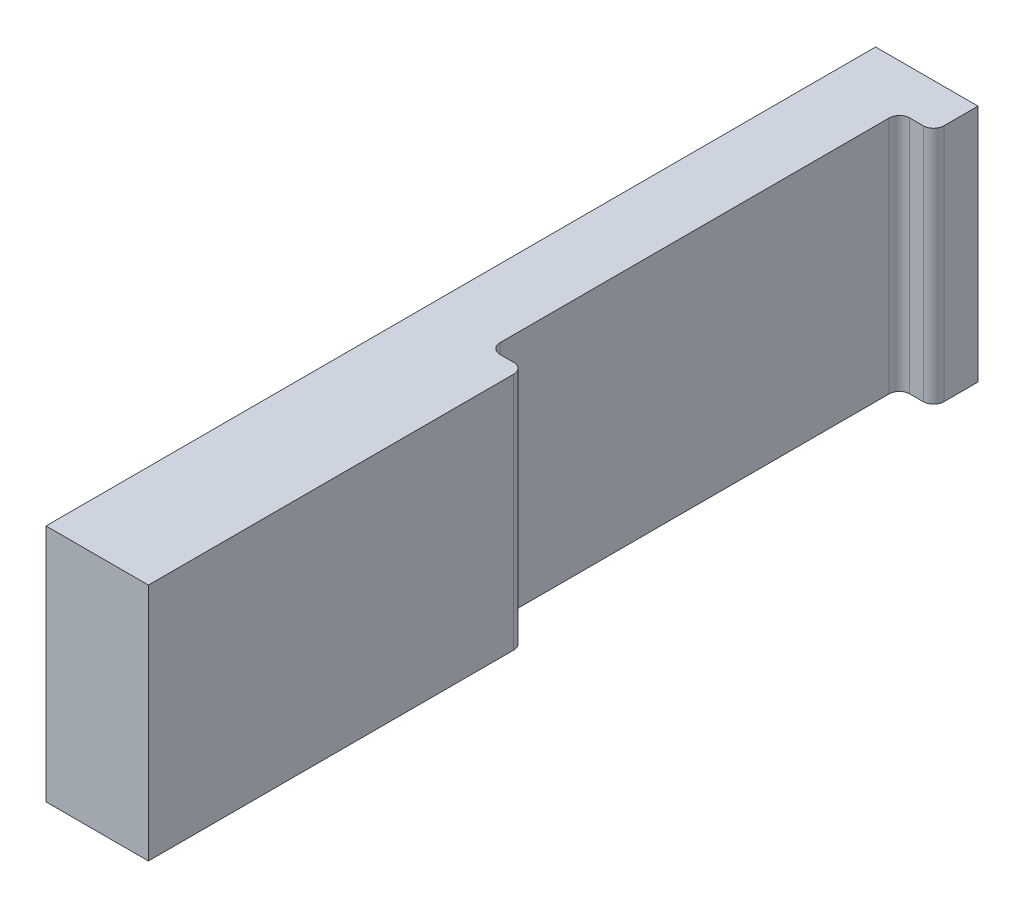
ISO-10303-21;
HEADER;
FILE_DESCRIPTION(('STEP AP214'),'2;1');
FILE_NAME('part.step','',(''),(''),'','','');
FILE_SCHEMA(('AUTOMOTIVE_DESIGN { 1 0 10303 214 1 1 1 1 }'));
ENDSEC;
DATA;
#1=APPLICATION_CONTEXT('core data for automotive mechanical design processes');
#2=APPLICATION_PROTOCOL_DEFINITION('international standard','automotive_design',2000,#1);
#3=PRODUCT_CONTEXT('',#1,'mechanical');
#4=PRODUCT('Part','Part','',(#3));
#5=PRODUCT_RELATED_PRODUCT_CATEGORY('part','',(#4));
#6=PRODUCT_DEFINITION_FORMATION('','',#4);
#7=PRODUCT_DEFINITION_CONTEXT('part definition',#1,'design');
#8=PRODUCT_DEFINITION('design','',#6,#7);
#9=PRODUCT_DEFINITION_SHAPE('','',#8);
#10=(LENGTH_UNIT() NAMED_UNIT(*) SI_UNIT(.MILLI.,.METRE.));
#11=(NAMED_UNIT(*) PLANE_ANGLE_UNIT() SI_UNIT($,.RADIAN.));
#12=(NAMED_UNIT(*) SI_UNIT($,.STERADIAN.) SOLID_ANGLE_UNIT());
#13=UNCERTAINTY_MEASURE_WITH_UNIT(LENGTH_MEASURE(1.E-05),#10,'distance_accuracy_value','');
#14=(GEOMETRIC_REPRESENTATION_CONTEXT(3) GLOBAL_UNCERTAINTY_ASSIGNED_CONTEXT((#13)) GLOBAL_UNIT_ASSIGNED_CONTEXT((#10,
#11,#12)) REPRESENTATION_CONTEXT('',''));
#15=CARTESIAN_POINT('',(0.,0.,0.));
#16=DIRECTION('',(0.,0.,1.));
#17=DIRECTION('',(1.,0.,0.));
#18=AXIS2_PLACEMENT_3D('',#15,#16,#17);
#19=CARTESIAN_POINT('',(39.76358420169,70.,-88.5010150339644));
#20=DIRECTION('',(-1.,0.,0.));
#21=DIRECTION('',(0.,0.,1.));
#22=AXIS2_PLACEMENT_3D('',#19,#20,#21);
#23=PLANE('',#22);
#24=DIRECTION('',(0.,0.,-1.));
#25=VECTOR('',#24,1.);
#26=CARTESIAN_POINT('',(39.76358420169,0.,-88.5010150339644));
#27=LINE('',#26,#25);
#28=CARTESIAN_POINT('',(39.76358420169,0.,154.498984966036));
#29=VERTEX_POINT('',#28);
#30=CARTESIAN_POINT('',(39.76358420169,0.,47.4989849660356));
#31=VERTEX_POINT('',#30);
#32=EDGE_CURVE('E223',#29,#31,#27,.T.);
#33=ORIENTED_EDGE('',*,*,#32,.T.);
#34=DIRECTION('',(0.,1.,0.));
#35=VECTOR('',#34,1.);
#36=CARTESIAN_POINT('',(39.76358420169,70.,47.4989849660356));
#37=LINE('',#36,#35);
#38=CARTESIAN_POINT('',(39.76358420169,70.,47.4989849660356));
#39=VERTEX_POINT('',#38);
#40=EDGE_CURVE('E175',#31,#39,#37,.T.);
#41=ORIENTED_EDGE('',*,*,#40,.T.);
#42=DIRECTION('',(0.,0.,-1.));
#43=VECTOR('',#42,1.);
#44=CARTESIAN_POINT('',(39.76358420169,70.,-88.5010150339644));
#45=LINE('',#44,#43);
#46=CARTESIAN_POINT('',(39.76358420169,70.,154.498984966036));
#47=VERTEX_POINT('',#46);
#48=EDGE_CURVE('E217',#47,#39,#45,.T.);
#49=ORIENTED_EDGE('',*,*,#48,.F.);
#50=DIRECTION('',(0.,-1.,0.));
#51=VECTOR('',#50,1.);
#52=CARTESIAN_POINT('',(39.76358420169,70.,154.498984966036));
#53=LINE('',#52,#51);
#54=EDGE_CURVE('E131',#47,#29,#53,.T.);
#55=ORIENTED_EDGE('',*,*,#54,.T.);
#56=EDGE_LOOP('',(#33,#41,#49,#55));
#57=FACE_BOUND('',#56,.T.);
#58=ADVANCED_FACE('F33',(#57),#23,.F.);
#59=CARTESIAN_POINT('',(9.76358420168996,70.,-88.5010150339644));
#60=DIRECTION('',(1.,0.,0.));
#61=DIRECTION('',(0.,0.,-1.));
#62=AXIS2_PLACEMENT_3D('',#59,#60,#61);
#63=PLANE('',#62);
#64=DIRECTION('',(0.,0.,1.));
#65=VECTOR('',#64,1.);
#66=CARTESIAN_POINT('',(9.76358420168996,0.,-88.5010150339644));
#67=LINE('',#66,#65);
#68=CARTESIAN_POINT('',(9.76358420168996,0.,-88.5010150339644));
#69=VERTEX_POINT('',#68);
#70=CARTESIAN_POINT('',(9.76358420168999,0.,154.498984966036));
#71=VERTEX_POINT('',#70);
#72=EDGE_CURVE('E150',#69,#71,#67,.T.);
#73=ORIENTED_EDGE('',*,*,#72,.T.);
#74=DIRECTION('',(0.,-1.,0.));
#75=VECTOR('',#74,1.);
#76=CARTESIAN_POINT('',(9.76358420168999,70.,154.498984966036));
#77=LINE('',#76,#75);
#78=CARTESIAN_POINT('',(9.76358420168999,70.,154.498984966036));
#79=VERTEX_POINT('',#78);
#80=EDGE_CURVE('E128',#79,#71,#77,.T.);
#81=ORIENTED_EDGE('',*,*,#80,.F.);
#82=DIRECTION('',(0.,0.,1.));
#83=VECTOR('',#82,1.);
#84=CARTESIAN_POINT('',(9.76358420168996,70.,-88.5010150339644));
#85=LINE('',#84,#83);
#86=CARTESIAN_POINT('',(9.76358420168996,70.,-88.5010150339644));
#87=VERTEX_POINT('',#86);
#88=EDGE_CURVE('E136',#87,#79,#85,.T.);
#89=ORIENTED_EDGE('',*,*,#88,.F.);
#90=DIRECTION('',(0.,-1.,0.));
#91=VECTOR('',#90,1.);
#92=CARTESIAN_POINT('',(9.76358420168996,70.,-88.5010150339644));
#93=LINE('',#92,#91);
#94=EDGE_CURVE('E219',#87,#69,#93,.T.);
#95=ORIENTED_EDGE('',*,*,#94,.T.);
#96=EDGE_LOOP('',(#73,#81,#89,#95));
#97=FACE_BOUND('',#96,.T.);
#98=ADVANCED_FACE('F148',(#97),#63,.F.);
#99=CARTESIAN_POINT('',(9.76358420168999,70.,154.498984966036));
#100=DIRECTION('',(0.,0.,-1.));
#101=DIRECTION('',(-1.,0.,0.));
#102=AXIS2_PLACEMENT_3D('',#99,#100,#101);
#103=PLANE('',#102);
#104=DIRECTION('',(1.,0.,0.));
#105=VECTOR('',#104,1.);
#106=CARTESIAN_POINT('',(9.76358420168999,0.,154.498984966036));
#107=LINE('',#106,#105);
#108=EDGE_CURVE('E207',#71,#29,#107,.T.);
#109=ORIENTED_EDGE('',*,*,#108,.T.);
#110=ORIENTED_EDGE('',*,*,#54,.F.);
#111=DIRECTION('',(1.,0.,0.));
#112=VECTOR('',#111,1.);
#113=CARTESIAN_POINT('',(9.76358420168999,70.,154.498984966036));
#114=LINE('',#113,#112);
#115=EDGE_CURVE('E124',#79,#47,#114,.T.);
#116=ORIENTED_EDGE('',*,*,#115,.F.);
#117=ORIENTED_EDGE('',*,*,#80,.T.);
#118=EDGE_LOOP('',(#109,#110,#116,#117));
#119=FACE_BOUND('',#118,.T.);
#120=ADVANCED_FACE('F126',(#119),#103,.F.);
#121=CARTESIAN_POINT('',(39.76358420169,70.,-78.5010150339644));
#122=VERTEX_POINT('',#121);
#123=CARTESIAN_POINT('',(39.76358420169,70.,-88.5010150339644));
#124=VERTEX_POINT('',#123);
#125=EDGE_CURVE('E135',#122,#124,#45,.T.);
#126=ORIENTED_EDGE('',*,*,#125,.F.);
#127=DIRECTION('',(0.,1.,0.));
#128=VECTOR('',#127,1.);
#129=CARTESIAN_POINT('',(39.76358420169,70.,-78.5010150339644));
#130=LINE('',#129,#128);
#131=CARTESIAN_POINT('',(39.76358420169,0.,-78.5010150339644));
#132=VERTEX_POINT('',#131);
#133=EDGE_CURVE('E165',#122,#132,#130,.F.);
#134=ORIENTED_EDGE('',*,*,#133,.T.);
#135=CARTESIAN_POINT('',(39.76358420169,0.,-88.5010150339644));
#136=VERTEX_POINT('',#135);
#137=EDGE_CURVE('E222',#132,#136,#27,.T.);
#138=ORIENTED_EDGE('',*,*,#137,.T.);
#139=DIRECTION('',(0.,-1.,0.));
#140=VECTOR('',#139,1.);
#141=CARTESIAN_POINT('',(39.76358420169,70.,-88.5010150339644));
#142=LINE('',#141,#140);
#143=EDGE_CURVE('E155',#124,#136,#142,.T.);
#144=ORIENTED_EDGE('',*,*,#143,.F.);
#145=EDGE_LOOP('',(#126,#134,#138,#144));
#146=FACE_BOUND('',#145,.T.);
#147=ADVANCED_FACE('F250',(#146),#23,.F.);
#148=CARTESIAN_POINT('',(9.76358420168996,70.,-88.5010150339644));
#149=DIRECTION('',(0.,0.,1.));
#150=DIRECTION('',(1.,0.,0.));
#151=AXIS2_PLACEMENT_3D('',#148,#149,#150);
#152=PLANE('',#151);
#153=DIRECTION('',(-1.,0.,0.));
#154=VECTOR('',#153,1.);
#155=CARTESIAN_POINT('',(9.76358420168996,0.,-88.5010150339644));
#156=LINE('',#155,#154);
#157=EDGE_CURVE('E146',#136,#69,#156,.T.);
#158=ORIENTED_EDGE('',*,*,#157,.T.);
#159=ORIENTED_EDGE('',*,*,#94,.F.);
#160=DIRECTION('',(-1.,0.,0.));
#161=VECTOR('',#160,1.);
#162=CARTESIAN_POINT('',(9.76358420168996,70.,-88.5010150339644));
#163=LINE('',#162,#161);
#164=EDGE_CURVE('E142',#124,#87,#163,.T.);
#165=ORIENTED_EDGE('',*,*,#164,.F.);
#166=ORIENTED_EDGE('',*,*,#143,.T.);
#167=EDGE_LOOP('',(#158,#159,#165,#166));
#168=FACE_BOUND('',#167,.T.);
#169=ADVANCED_FACE('F230',(#168),#152,.F.);
#170=CARTESIAN_POINT('',(0.,70.,0.));
#171=DIRECTION('',(0.,1.,0.));
#172=DIRECTION('',(0.,0.,1.));
#173=AXIS2_PLACEMENT_3D('',#170,#171,#172);
#174=PLANE('',#173);
#175=DIRECTION('',(-1.,0.,0.));
#176=VECTOR('',#175,1.);
#177=CARTESIAN_POINT('',(39.76358420169,70.,-75.5010150339644));
#178=LINE('',#177,#176);
#179=CARTESIAN_POINT('',(36.76358420169,70.,-75.5010150339644));
#180=VERTEX_POINT('',#179);
#181=CARTESIAN_POINT('',(32.76358420169,70.,-75.5010150339644));
#182=VERTEX_POINT('',#181);
#183=EDGE_CURVE('E198',#180,#182,#178,.T.);
#184=ORIENTED_EDGE('',*,*,#183,.F.);
#185=CARTESIAN_POINT('',(36.76358420169,70.,-78.5010150339644));
#186=DIRECTION('',(0.,1.,0.));
#187=DIRECTION('',(0.,0.,1.));
#188=AXIS2_PLACEMENT_3D('',#185,#186,#187);
#189=CIRCLE('',#188,3.);
#190=EDGE_CURVE('E163',#180,#122,#189,.T.);
#191=ORIENTED_EDGE('',*,*,#190,.T.);
#192=ORIENTED_EDGE('',*,*,#125,.T.);
#193=ORIENTED_EDGE('',*,*,#164,.T.);
#194=ORIENTED_EDGE('',*,*,#88,.T.);
#195=ORIENTED_EDGE('',*,*,#115,.T.);
#196=ORIENTED_EDGE('',*,*,#48,.T.);
#197=CARTESIAN_POINT('',(36.76358420169,70.,47.4989849660356));
#198=DIRECTION('',(0.,1.,0.));
#199=DIRECTION('',(0.,0.,1.));
#200=AXIS2_PLACEMENT_3D('',#197,#198,#199);
#201=CIRCLE('',#200,3.);
#202=CARTESIAN_POINT('',(36.76358420169,70.,44.4989849660356));
#203=VERTEX_POINT('',#202);
#204=EDGE_CURVE('E161',#39,#203,#201,.T.);
#205=ORIENTED_EDGE('',*,*,#204,.T.);
#206=DIRECTION('',(1.,0.,0.));
#207=VECTOR('',#206,1.);
#208=CARTESIAN_POINT('',(39.76358420169,70.,44.4989849660356));
#209=LINE('',#208,#207);
#210=CARTESIAN_POINT('',(32.76358420169,70.,44.4989849660356));
#211=VERTEX_POINT('',#210);
#212=EDGE_CURVE('E189',#211,#203,#209,.T.);
#213=ORIENTED_EDGE('',*,*,#212,.F.);
#214=CARTESIAN_POINT('',(32.76358420169,70.,41.4989849660356));
#215=DIRECTION('',(0.,1.,0.));
#216=DIRECTION('',(0.,0.,1.));
#217=AXIS2_PLACEMENT_3D('',#214,#215,#216);
#218=CIRCLE('',#217,3.);
#219=CARTESIAN_POINT('',(29.76358420169,70.,41.4989849660356));
#220=VERTEX_POINT('',#219);
#221=EDGE_CURVE('E41',#211,#220,#218,.F.);
#222=ORIENTED_EDGE('',*,*,#221,.T.);
#223=DIRECTION('',(0.,0.,1.));
#224=VECTOR('',#223,1.);
#225=CARTESIAN_POINT('',(29.76358420169,70.,-75.5010150339644));
#226=LINE('',#225,#224);
#227=CARTESIAN_POINT('',(29.76358420169,70.,-72.5010150339644));
#228=VERTEX_POINT('',#227);
#229=EDGE_CURVE('E188',#228,#220,#226,.T.);
#230=ORIENTED_EDGE('',*,*,#229,.F.);
#231=CARTESIAN_POINT('',(32.76358420169,70.,-72.5010150339644));
#232=DIRECTION('',(0.,1.,0.));
#233=DIRECTION('',(0.,0.,1.));
#234=AXIS2_PLACEMENT_3D('',#231,#232,#233);
#235=CIRCLE('',#234,3.);
#236=EDGE_CURVE('E182',#228,#182,#235,.F.);
#237=ORIENTED_EDGE('',*,*,#236,.T.);
#238=EDGE_LOOP('',(#184,#191,#192,#193,#194,#195,#196,#205,#213,#222,#230,#237));
#239=FACE_BOUND('',#238,.T.);
#240=ADVANCED_FACE('F140',(#239),#174,.T.);
#241=CARTESIAN_POINT('',(0.,0.,0.));
#242=DIRECTION('',(0.,1.,0.));
#243=DIRECTION('',(0.,0.,1.));
#244=AXIS2_PLACEMENT_3D('',#241,#242,#243);
#245=PLANE('',#244);
#246=CARTESIAN_POINT('',(19.76358420169,0.,-10.1310150339644));
#247=DIRECTION('',(0.,-1.,0.));
#248=DIRECTION('',(0.,0.,-1.));
#249=AXIS2_PLACEMENT_3D('',#246,#247,#248);
#250=CIRCLE('',#249,1.5);
#251=CARTESIAN_POINT('',(19.76358420169,0.,-11.6310150339644));
#252=VERTEX_POINT('',#251);
#253=EDGE_CURVE('E278',#252,#252,#250,.T.);
#254=ORIENTED_EDGE('',*,*,#253,.F.);
#255=EDGE_LOOP('',(#254));
#256=FACE_BOUND('',#255,.T.);
#257=CARTESIAN_POINT('',(29.76358420169,0.,124.498984966036));
#258=DIRECTION('',(0.,-1.,0.));
#259=DIRECTION('',(0.,0.,-1.));
#260=AXIS2_PLACEMENT_3D('',#257,#258,#259);
#261=CIRCLE('',#260,1.5);
#262=CARTESIAN_POINT('',(29.76358420169,0.,122.998984966036));
#263=VERTEX_POINT('',#262);
#264=EDGE_CURVE('E272',#263,#263,#261,.T.);
#265=ORIENTED_EDGE('',*,*,#264,.F.);
#266=EDGE_LOOP('',(#265));
#267=FACE_BOUND('',#266,.T.);
#268=ORIENTED_EDGE('',*,*,#137,.F.);
#269=CARTESIAN_POINT('',(36.76358420169,0.,-78.5010150339644));
#270=DIRECTION('',(0.,1.,0.));
#271=DIRECTION('',(0.,0.,1.));
#272=AXIS2_PLACEMENT_3D('',#269,#270,#271);
#273=CIRCLE('',#272,3.);
#274=CARTESIAN_POINT('',(36.76358420169,0.,-75.5010150339644));
#275=VERTEX_POINT('',#274);
#276=EDGE_CURVE('E168',#132,#275,#273,.F.);
#277=ORIENTED_EDGE('',*,*,#276,.T.);
#278=DIRECTION('',(-1.,0.,0.));
#279=VECTOR('',#278,1.);
#280=CARTESIAN_POINT('',(39.76358420169,0.,-75.5010150339644));
#281=LINE('',#280,#279);
#282=CARTESIAN_POINT('',(32.76358420169,0.,-75.5010150339644));
#283=VERTEX_POINT('',#282);
#284=EDGE_CURVE('E209',#275,#283,#281,.T.);
#285=ORIENTED_EDGE('',*,*,#284,.T.);
#286=CARTESIAN_POINT('',(32.76358420169,0.,-72.5010150339644));
#287=DIRECTION('',(0.,1.,0.));
#288=DIRECTION('',(0.,0.,1.));
#289=AXIS2_PLACEMENT_3D('',#286,#287,#288);
#290=CIRCLE('',#289,3.);
#291=CARTESIAN_POINT('',(29.76358420169,0.,-72.5010150339644));
#292=VERTEX_POINT('',#291);
#293=EDGE_CURVE('E184',#283,#292,#290,.T.);
#294=ORIENTED_EDGE('',*,*,#293,.T.);
#295=DIRECTION('',(0.,0.,1.));
#296=VECTOR('',#295,1.);
#297=CARTESIAN_POINT('',(29.76358420169,0.,-75.5010150339644));
#298=LINE('',#297,#296);
#299=CARTESIAN_POINT('',(29.76358420169,0.,41.4989849660356));
#300=VERTEX_POINT('',#299);
#301=EDGE_CURVE('E204',#292,#300,#298,.T.);
#302=ORIENTED_EDGE('',*,*,#301,.T.);
#303=CARTESIAN_POINT('',(32.76358420169,0.,41.4989849660356));
#304=DIRECTION('',(0.,1.,0.));
#305=DIRECTION('',(0.,0.,1.));
#306=AXIS2_PLACEMENT_3D('',#303,#304,#305);
#307=CIRCLE('',#306,3.);
#308=CARTESIAN_POINT('',(32.76358420169,0.,44.4989849660356));
#309=VERTEX_POINT('',#308);
#310=EDGE_CURVE('E11',#300,#309,#307,.T.);
#311=ORIENTED_EDGE('',*,*,#310,.T.);
#312=DIRECTION('',(1.,0.,0.));
#313=VECTOR('',#312,1.);
#314=CARTESIAN_POINT('',(39.76358420169,0.,44.4989849660356));
#315=LINE('',#314,#313);
#316=CARTESIAN_POINT('',(36.76358420169,0.,44.4989849660356));
#317=VERTEX_POINT('',#316);
#318=EDGE_CURVE('E203',#309,#317,#315,.T.);
#319=ORIENTED_EDGE('',*,*,#318,.T.);
#320=CARTESIAN_POINT('',(36.76358420169,0.,47.4989849660356));
#321=DIRECTION('',(0.,1.,0.));
#322=DIRECTION('',(0.,0.,1.));
#323=AXIS2_PLACEMENT_3D('',#320,#321,#322);
#324=CIRCLE('',#323,3.);
#325=EDGE_CURVE('E48',#317,#31,#324,.F.);
#326=ORIENTED_EDGE('',*,*,#325,.T.);
#327=ORIENTED_EDGE('',*,*,#32,.F.);
#328=ORIENTED_EDGE('',*,*,#108,.F.);
#329=ORIENTED_EDGE('',*,*,#72,.F.);
#330=ORIENTED_EDGE('',*,*,#157,.F.);
#331=EDGE_LOOP('',(#268,#277,#285,#294,#302,#311,#319,#326,#327,#328,#329,#330));
#332=FACE_BOUND('',#331,.T.);
#333=ADVANCED_FACE('F202',(#256,#267,#332),#245,.F.);
#334=CARTESIAN_POINT('',(39.76358420169,0.,44.4989849660356));
#335=DIRECTION('',(0.,0.,1.));
#336=DIRECTION('',(1.,0.,0.));
#337=AXIS2_PLACEMENT_3D('',#334,#335,#336);
#338=PLANE('',#337);
#339=ORIENTED_EDGE('',*,*,#212,.T.);
#340=DIRECTION('',(0.,1.,0.));
#341=VECTOR('',#340,1.);
#342=CARTESIAN_POINT('',(36.76358420169,0.,44.4989849660356));
#343=LINE('',#342,#341);
#344=EDGE_CURVE('E56',#203,#317,#343,.F.);
#345=ORIENTED_EDGE('',*,*,#344,.T.);
#346=ORIENTED_EDGE('',*,*,#318,.F.);
#347=DIRECTION('',(0.,1.,0.));
#348=VECTOR('',#347,1.);
#349=CARTESIAN_POINT('',(32.76358420169,70.,44.4989849660356));
#350=LINE('',#349,#348);
#351=EDGE_CURVE('E178',#309,#211,#350,.T.);
#352=ORIENTED_EDGE('',*,*,#351,.T.);
#353=EDGE_LOOP('',(#339,#345,#346,#352));
#354=FACE_BOUND('',#353,.T.);
#355=ADVANCED_FACE('F205',(#354),#338,.F.);
#356=CARTESIAN_POINT('',(29.76358420169,0.,-75.5010150339644));
#357=DIRECTION('',(-1.,0.,0.));
#358=DIRECTION('',(0.,0.,1.));
#359=AXIS2_PLACEMENT_3D('',#356,#357,#358);
#360=PLANE('',#359);
#361=ORIENTED_EDGE('',*,*,#301,.F.);
#362=DIRECTION('',(0.,1.,0.));
#363=VECTOR('',#362,1.);
#364=CARTESIAN_POINT('',(29.76358420169,70.,-72.5010150339644));
#365=LINE('',#364,#363);
#366=EDGE_CURVE('E172',#292,#228,#365,.T.);
#367=ORIENTED_EDGE('',*,*,#366,.T.);
#368=ORIENTED_EDGE('',*,*,#229,.T.);
#369=DIRECTION('',(0.,1.,0.));
#370=VECTOR('',#369,1.);
#371=CARTESIAN_POINT('',(29.76358420169,0.,41.4989849660356));
#372=LINE('',#371,#370);
#373=EDGE_CURVE('E170',#220,#300,#372,.F.);
#374=ORIENTED_EDGE('',*,*,#373,.T.);
#375=EDGE_LOOP('',(#361,#367,#368,#374));
#376=FACE_BOUND('',#375,.T.);
#377=ADVANCED_FACE('F195',(#376),#360,.F.);
#378=CARTESIAN_POINT('',(39.76358420169,0.,-75.5010150339644));
#379=DIRECTION('',(0.,0.,-1.));
#380=DIRECTION('',(-1.,0.,0.));
#381=AXIS2_PLACEMENT_3D('',#378,#379,#380);
#382=PLANE('',#381);
#383=ORIENTED_EDGE('',*,*,#284,.F.);
#384=DIRECTION('',(0.,1.,0.));
#385=VECTOR('',#384,1.);
#386=CARTESIAN_POINT('',(36.76358420169,0.,-75.5010150339644));
#387=LINE('',#386,#385);
#388=EDGE_CURVE('E153',#275,#180,#387,.T.);
#389=ORIENTED_EDGE('',*,*,#388,.T.);
#390=ORIENTED_EDGE('',*,*,#183,.T.);
#391=DIRECTION('',(0.,1.,0.));
#392=VECTOR('',#391,1.);
#393=CARTESIAN_POINT('',(32.76358420169,0.,-75.5010150339644));
#394=LINE('',#393,#392);
#395=EDGE_CURVE('E151',#182,#283,#394,.F.);
#396=ORIENTED_EDGE('',*,*,#395,.T.);
#397=EDGE_LOOP('',(#383,#389,#390,#396));
#398=FACE_BOUND('',#397,.T.);
#399=ADVANCED_FACE('F269',(#398),#382,.F.);
#400=CARTESIAN_POINT('',(36.76358420169,0.,-78.5010150339644));
#401=DIRECTION('',(0.,1.,0.));
#402=DIRECTION('',(0.,0.,1.));
#403=AXIS2_PLACEMENT_3D('',#400,#401,#402);
#404=CYLINDRICAL_SURFACE('',#403,3.);
#405=ORIENTED_EDGE('',*,*,#276,.F.);
#406=ORIENTED_EDGE('',*,*,#133,.F.);
#407=ORIENTED_EDGE('',*,*,#190,.F.);
#408=ORIENTED_EDGE('',*,*,#388,.F.);
#409=EDGE_LOOP('',(#405,#406,#407,#408));
#410=FACE_BOUND('',#409,.T.);
#411=ADVANCED_FACE('F245',(#410),#404,.T.);
#412=CARTESIAN_POINT('',(32.76358420169,0.,-72.5010150339644));
#413=DIRECTION('',(0.,-1.,0.));
#414=DIRECTION('',(0.,0.,-1.));
#415=AXIS2_PLACEMENT_3D('',#412,#413,#414);
#416=CYLINDRICAL_SURFACE('',#415,3.);
#417=ORIENTED_EDGE('',*,*,#293,.F.);
#418=ORIENTED_EDGE('',*,*,#395,.F.);
#419=ORIENTED_EDGE('',*,*,#236,.F.);
#420=ORIENTED_EDGE('',*,*,#366,.F.);
#421=EDGE_LOOP('',(#417,#418,#419,#420));
#422=FACE_BOUND('',#421,.T.);
#423=ADVANCED_FACE('F239',(#422),#416,.F.);
#424=CARTESIAN_POINT('',(36.76358420169,70.,47.4989849660356));
#425=DIRECTION('',(0.,1.,0.));
#426=DIRECTION('',(0.,0.,1.));
#427=AXIS2_PLACEMENT_3D('',#424,#425,#426);
#428=CYLINDRICAL_SURFACE('',#427,3.);
#429=ORIENTED_EDGE('',*,*,#325,.F.);
#430=ORIENTED_EDGE('',*,*,#344,.F.);
#431=ORIENTED_EDGE('',*,*,#204,.F.);
#432=ORIENTED_EDGE('',*,*,#40,.F.);
#433=EDGE_LOOP('',(#429,#430,#431,#432));
#434=FACE_BOUND('',#433,.T.);
#435=ADVANCED_FACE('F237',(#434),#428,.T.);
#436=CARTESIAN_POINT('',(32.76358420169,0.,41.4989849660356));
#437=DIRECTION('',(0.,-1.,0.));
#438=DIRECTION('',(0.,0.,-1.));
#439=AXIS2_PLACEMENT_3D('',#436,#437,#438);
#440=CYLINDRICAL_SURFACE('',#439,3.);
#441=ORIENTED_EDGE('',*,*,#310,.F.);
#442=ORIENTED_EDGE('',*,*,#373,.F.);
#443=ORIENTED_EDGE('',*,*,#221,.F.);
#444=ORIENTED_EDGE('',*,*,#351,.F.);
#445=EDGE_LOOP('',(#441,#442,#443,#444));
#446=FACE_BOUND('',#445,.T.);
#447=ADVANCED_FACE('F35',(#446),#440,.F.);
#448=CARTESIAN_POINT('',(29.76358420169,20.,124.498984966036));
#449=DIRECTION('',(0.,-1.,0.));
#450=DIRECTION('',(0.,0.,-1.));
#451=AXIS2_PLACEMENT_3D('',#448,#449,#450);
#452=CYLINDRICAL_SURFACE('',#451,1.5);
#453=CARTESIAN_POINT('',(29.76358420169,20.,124.498984966036));
#454=DIRECTION('',(0.,-1.,0.));
#455=DIRECTION('',(0.,0.,-1.));
#456=AXIS2_PLACEMENT_3D('',#453,#454,#455);
#457=CIRCLE('',#456,1.5);
#458=CARTESIAN_POINT('',(29.76358420169,20.,122.998984966036));
#459=VERTEX_POINT('',#458);
#460=EDGE_CURVE('E275',#459,#459,#457,.T.);
#461=ORIENTED_EDGE('',*,*,#460,.F.);
#462=EDGE_LOOP('',(#461));
#463=FACE_BOUND('',#462,.T.);
#464=ORIENTED_EDGE('',*,*,#264,.T.);
#465=EDGE_LOOP('',(#464));
#466=FACE_BOUND('',#465,.T.);
#467=ADVANCED_FACE('F244',(#463,#466),#452,.F.);
#468=CARTESIAN_POINT('',(29.76358420169,20.,124.498984966036));
#469=DIRECTION('',(0.,-1.,0.));
#470=DIRECTION('',(0.,0.,-1.));
#471=AXIS2_PLACEMENT_3D('',#468,#469,#470);
#472=PLANE('',#471);
#473=ORIENTED_EDGE('',*,*,#460,.T.);
#474=EDGE_LOOP('',(#473));
#475=FACE_BOUND('',#474,.T.);
#476=ADVANCED_FACE('F289',(#475),#472,.T.);
#477=CARTESIAN_POINT('',(19.76358420169,20.,-10.1310150339644));
#478=DIRECTION('',(0.,-1.,0.));
#479=DIRECTION('',(0.,0.,-1.));
#480=AXIS2_PLACEMENT_3D('',#477,#478,#479);
#481=CYLINDRICAL_SURFACE('',#480,1.5);
#482=CARTESIAN_POINT('',(19.76358420169,20.,-10.1310150339644));
#483=DIRECTION('',(0.,-1.,0.));
#484=DIRECTION('',(0.,0.,-1.));
#485=AXIS2_PLACEMENT_3D('',#482,#483,#484);
#486=CIRCLE('',#485,1.5);
#487=CARTESIAN_POINT('',(19.76358420169,20.,-11.6310150339644));
#488=VERTEX_POINT('',#487);
#489=EDGE_CURVE('E214',#488,#488,#486,.T.);
#490=ORIENTED_EDGE('',*,*,#489,.F.);
#491=EDGE_LOOP('',(#490));
#492=FACE_BOUND('',#491,.T.);
#493=ORIENTED_EDGE('',*,*,#253,.T.);
#494=EDGE_LOOP('',(#493));
#495=FACE_BOUND('',#494,.T.);
#496=ADVANCED_FACE('F286',(#492,#495),#481,.F.);
#497=CARTESIAN_POINT('',(19.76358420169,20.,-10.1310150339644));
#498=DIRECTION('',(0.,-1.,0.));
#499=DIRECTION('',(0.,0.,-1.));
#500=AXIS2_PLACEMENT_3D('',#497,#498,#499);
#501=PLANE('',#500);
#502=ORIENTED_EDGE('',*,*,#489,.T.);
#503=EDGE_LOOP('',(#502));
#504=FACE_BOUND('',#503,.T.);
#505=ADVANCED_FACE('F284',(#504),#501,.T.);
#506=CLOSED_SHELL('',(#58,#98,#120,#147,#169,#240,#333,#355,#377,#399,#411,#423,#435,#447,#467,
#476,#496,#505));
#507=MANIFOLD_SOLID_BREP('B2',#506);
#508=ADVANCED_BREP_SHAPE_REPRESENTATION('',(#18,#507),#14);
#509=SHAPE_DEFINITION_REPRESENTATION(#9,#508);
ENDSEC;
END-ISO-10303-21;
